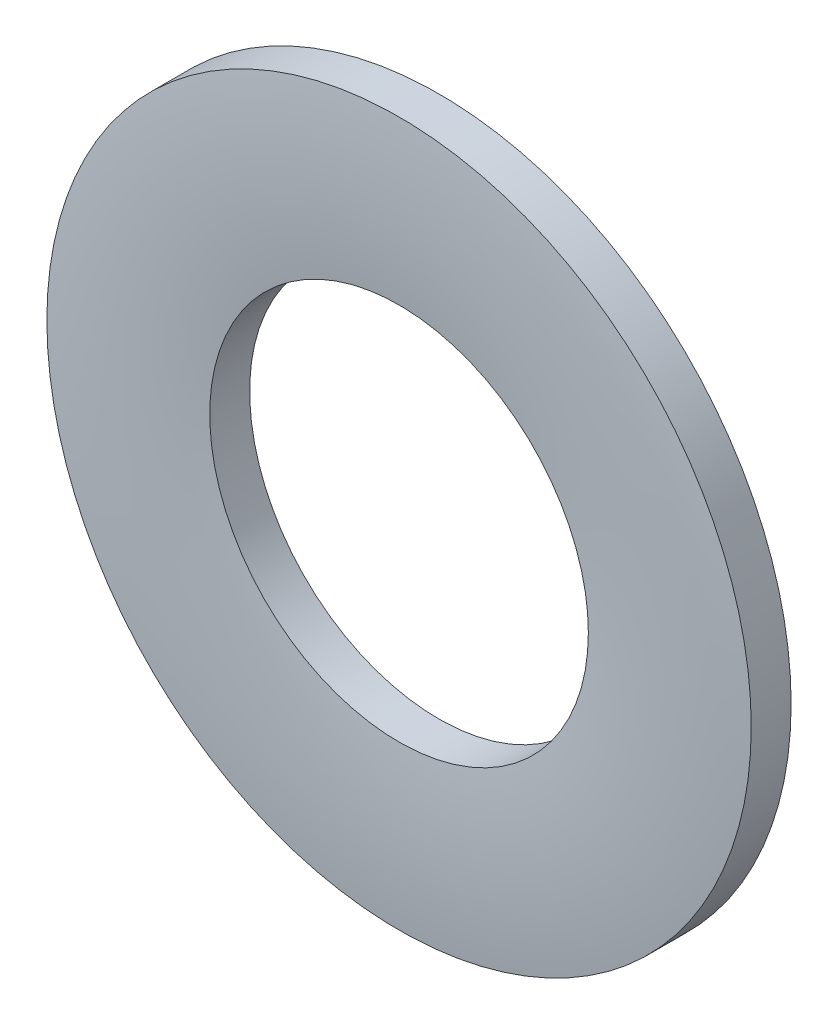
ISO-10303-21;
HEADER;
FILE_DESCRIPTION(('STEP AP214'),'2;1');
FILE_NAME('part.step','',(''),(''),'','','');
FILE_SCHEMA(('AUTOMOTIVE_DESIGN { 1 0 10303 214 1 1 1 1 }'));
ENDSEC;
DATA;
#1=APPLICATION_CONTEXT('core data for automotive mechanical design processes');
#2=APPLICATION_PROTOCOL_DEFINITION('international standard','automotive_design',2000,#1);
#3=PRODUCT_CONTEXT('',#1,'mechanical');
#4=PRODUCT('Part','Part','',(#3));
#5=PRODUCT_RELATED_PRODUCT_CATEGORY('part','',(#4));
#6=PRODUCT_DEFINITION_FORMATION('','',#4);
#7=PRODUCT_DEFINITION_CONTEXT('part definition',#1,'design');
#8=PRODUCT_DEFINITION('design','',#6,#7);
#9=PRODUCT_DEFINITION_SHAPE('','',#8);
#10=(LENGTH_UNIT() NAMED_UNIT(*) SI_UNIT(.MILLI.,.METRE.));
#11=(NAMED_UNIT(*) PLANE_ANGLE_UNIT() SI_UNIT($,.RADIAN.));
#12=(NAMED_UNIT(*) SI_UNIT($,.STERADIAN.) SOLID_ANGLE_UNIT());
#13=UNCERTAINTY_MEASURE_WITH_UNIT(LENGTH_MEASURE(1.E-05),#10,'distance_accuracy_value','');
#14=(GEOMETRIC_REPRESENTATION_CONTEXT(3) GLOBAL_UNCERTAINTY_ASSIGNED_CONTEXT((#13)) GLOBAL_UNIT_ASSIGNED_CONTEXT((#10,
#11,#12)) REPRESENTATION_CONTEXT('',''));
#15=CARTESIAN_POINT('',(0.,0.,0.));
#16=DIRECTION('',(0.,0.,1.));
#17=DIRECTION('',(1.,0.,0.));
#18=AXIS2_PLACEMENT_3D('',#15,#16,#17);
#19=CARTESIAN_POINT('',(0.,2.15,-0.25));
#20=DIRECTION('',(0.,0.,1.));
#21=DIRECTION('',(1.,0.,0.));
#22=AXIS2_PLACEMENT_3D('',#19,#20,#21);
#23=PLANE('',#22);
#24=CARTESIAN_POINT('',(0.,0.,-0.25));
#25=DIRECTION('',(0.,0.,1.));
#26=DIRECTION('',(1.,0.,0.));
#27=AXIS2_PLACEMENT_3D('',#24,#25,#26);
#28=CIRCLE('',#27,4.);
#29=CARTESIAN_POINT('',(4.,0.,-0.25));
#30=VERTEX_POINT('',#29);
#31=EDGE_CURVE('E46',#30,#30,#28,.T.);
#32=ORIENTED_EDGE('',*,*,#31,.F.);
#33=EDGE_LOOP('',(#32));
#34=FACE_BOUND('',#33,.T.);
#35=CARTESIAN_POINT('',(0.,0.,-0.25));
#36=DIRECTION('',(0.,0.,1.));
#37=DIRECTION('',(1.,0.,0.));
#38=AXIS2_PLACEMENT_3D('',#35,#36,#37);
#39=CIRCLE('',#38,2.15);
#40=CARTESIAN_POINT('',(2.15,0.,-0.25));
#41=VERTEX_POINT('',#40);
#42=EDGE_CURVE('E10',#41,#41,#39,.T.);
#43=ORIENTED_EDGE('',*,*,#42,.T.);
#44=EDGE_LOOP('',(#43));
#45=FACE_BOUND('',#44,.T.);
#46=ADVANCED_FACE('F32',(#34,#45),#23,.F.);
#47=CARTESIAN_POINT('',(0.,0.,0.25));
#48=DIRECTION('',(0.,0.,1.));
#49=DIRECTION('',(1.,0.,0.));
#50=AXIS2_PLACEMENT_3D('',#47,#48,#49);
#51=CYLINDRICAL_SURFACE('',#50,2.15);
#52=ORIENTED_EDGE('',*,*,#42,.F.);
#53=EDGE_LOOP('',(#52));
#54=FACE_BOUND('',#53,.T.);
#55=CARTESIAN_POINT('',(0.,0.,0.203149999999999));
#56=DIRECTION('',(0.,0.,1.));
#57=DIRECTION('',(1.,0.,0.));
#58=AXIS2_PLACEMENT_3D('',#55,#56,#57);
#59=CIRCLE('',#58,2.15);
#60=CARTESIAN_POINT('',(2.15,0.,0.203149999999999));
#61=VERTEX_POINT('',#60);
#62=EDGE_CURVE('E38',#61,#61,#59,.T.);
#63=ORIENTED_EDGE('',*,*,#62,.T.);
#64=EDGE_LOOP('',(#63));
#65=FACE_BOUND('',#64,.T.);
#66=ADVANCED_FACE('F55',(#54,#65),#51,.F.);
#67=CARTESIAN_POINT('',(0.,0.,-8.90496181963717));
#68=DIRECTION('',(0.,0.,1.));
#69=DIRECTION('',(1.,0.,0.));
#70=AXIS2_PLACEMENT_3D('',#67,#68,#69);
#71=DEGENERATE_TOROIDAL_SURFACE('',#70,3.075,9.15496181963717,.T.);
#72=ORIENTED_EDGE('',*,*,#62,.F.);
#73=EDGE_LOOP('',(#72));
#74=FACE_BOUND('',#73,.T.);
#75=CARTESIAN_POINT('',(0.,0.,0.20315));
#76=DIRECTION('',(0.,0.,1.));
#77=DIRECTION('',(1.,0.,0.));
#78=AXIS2_PLACEMENT_3D('',#75,#76,#77);
#79=CIRCLE('',#78,4.);
#80=CARTESIAN_POINT('',(4.,0.,0.20315));
#81=VERTEX_POINT('',#80);
#82=EDGE_CURVE('E42',#81,#81,#79,.T.);
#83=ORIENTED_EDGE('',*,*,#82,.T.);
#84=EDGE_LOOP('',(#83));
#85=FACE_BOUND('',#84,.T.);
#86=ADVANCED_FACE('F59',(#74,#85),#71,.T.);
#87=CARTESIAN_POINT('',(0.,0.,0.25));
#88=DIRECTION('',(0.,0.,1.));
#89=DIRECTION('',(1.,0.,0.));
#90=AXIS2_PLACEMENT_3D('',#87,#88,#89);
#91=CYLINDRICAL_SURFACE('',#90,4.);
#92=ORIENTED_EDGE('',*,*,#82,.F.);
#93=EDGE_LOOP('',(#92));
#94=FACE_BOUND('',#93,.T.);
#95=ORIENTED_EDGE('',*,*,#31,.T.);
#96=EDGE_LOOP('',(#95));
#97=FACE_BOUND('',#96,.T.);
#98=ADVANCED_FACE('F52',(#94,#97),#91,.T.);
#99=CLOSED_SHELL('',(#46,#66,#86,#98));
#100=MANIFOLD_SOLID_BREP('B2',#99);
#101=ADVANCED_BREP_SHAPE_REPRESENTATION('',(#18,#100),#14);
#102=SHAPE_DEFINITION_REPRESENTATION(#9,#101);
ENDSEC;
END-ISO-10303-21;
